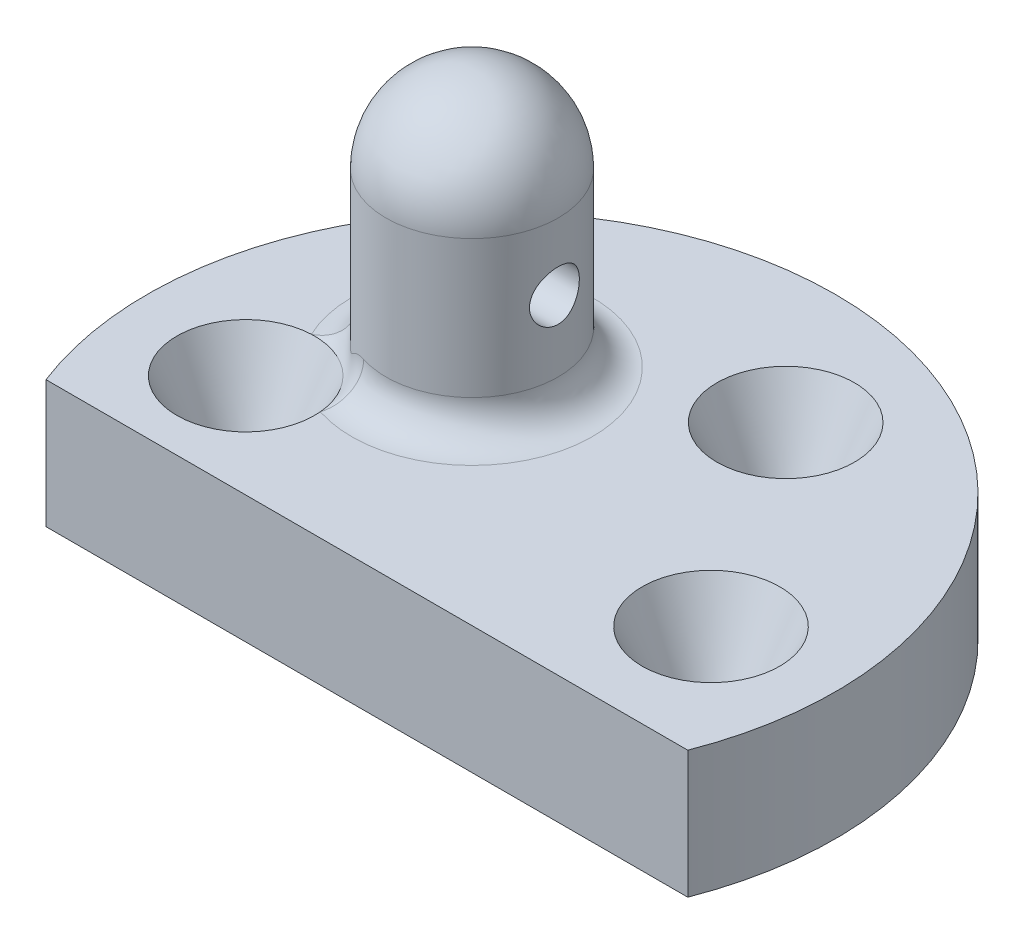
ISO-10303-21;
HEADER;
FILE_DESCRIPTION(('STEP AP214'),'2;1');
FILE_NAME('part.step','',(''),(''),'','','');
FILE_SCHEMA(('AUTOMOTIVE_DESIGN { 1 0 10303 214 1 1 1 1 }'));
ENDSEC;
DATA;
#1=APPLICATION_CONTEXT('core data for automotive mechanical design processes');
#2=APPLICATION_PROTOCOL_DEFINITION('international standard','automotive_design',2000,#1);
#3=PRODUCT_CONTEXT('',#1,'mechanical');
#4=PRODUCT('Part','Part','',(#3));
#5=PRODUCT_RELATED_PRODUCT_CATEGORY('part','',(#4));
#6=PRODUCT_DEFINITION_FORMATION('','',#4);
#7=PRODUCT_DEFINITION_CONTEXT('part definition',#1,'design');
#8=PRODUCT_DEFINITION('design','',#6,#7);
#9=PRODUCT_DEFINITION_SHAPE('','',#8);
#10=(LENGTH_UNIT() NAMED_UNIT(*) SI_UNIT(.MILLI.,.METRE.));
#11=(NAMED_UNIT(*) PLANE_ANGLE_UNIT() SI_UNIT($,.RADIAN.));
#12=(NAMED_UNIT(*) SI_UNIT($,.STERADIAN.) SOLID_ANGLE_UNIT());
#13=UNCERTAINTY_MEASURE_WITH_UNIT(LENGTH_MEASURE(1.E-05),#10,'distance_accuracy_value','');
#14=(GEOMETRIC_REPRESENTATION_CONTEXT(3) GLOBAL_UNCERTAINTY_ASSIGNED_CONTEXT((#13)) GLOBAL_UNIT_ASSIGNED_CONTEXT((#10,
#11,#12)) REPRESENTATION_CONTEXT('',''));
#15=CARTESIAN_POINT('',(0.,0.,0.));
#16=DIRECTION('',(0.,0.,1.));
#17=DIRECTION('',(1.,0.,0.));
#18=AXIS2_PLACEMENT_3D('',#15,#16,#17);
#19=CARTESIAN_POINT('',(0.,7.4,0.));
#20=DIRECTION('',(0.,-1.,0.));
#21=DIRECTION('',(0.,0.,-1.));
#22=AXIS2_PLACEMENT_3D('',#19,#20,#21);
#23=CYLINDRICAL_SURFACE('',#22,20.);
#24=CARTESIAN_POINT('',(0.,0.,0.));
#25=DIRECTION('',(0.,1.,0.));
#26=DIRECTION('',(0.,0.,1.));
#27=AXIS2_PLACEMENT_3D('',#24,#25,#26);
#28=CIRCLE('',#27,20.);
#29=CARTESIAN_POINT('',(18.6474421838492,0.,7.23));
#30=VERTEX_POINT('',#29);
#31=CARTESIAN_POINT('',(-18.6474421838492,0.,7.23));
#32=VERTEX_POINT('',#31);
#33=EDGE_CURVE('E104',#30,#32,#28,.T.);
#34=ORIENTED_EDGE('',*,*,#33,.T.);
#35=DIRECTION('',(0.,-1.,0.));
#36=VECTOR('',#35,1.);
#37=CARTESIAN_POINT('',(-18.6474421838492,7.4,7.23));
#38=LINE('',#37,#36);
#39=CARTESIAN_POINT('',(-18.6474421838492,7.4,7.23));
#40=VERTEX_POINT('',#39);
#41=EDGE_CURVE('E91',#40,#32,#38,.T.);
#42=ORIENTED_EDGE('',*,*,#41,.F.);
#43=CARTESIAN_POINT('',(0.,7.4,0.));
#44=DIRECTION('',(0.,1.,0.));
#45=DIRECTION('',(0.,0.,1.));
#46=AXIS2_PLACEMENT_3D('',#43,#44,#45);
#47=CIRCLE('',#46,20.);
#48=CARTESIAN_POINT('',(18.6474421838492,7.4,7.23));
#49=VERTEX_POINT('',#48);
#50=EDGE_CURVE('E97',#49,#40,#47,.T.);
#51=ORIENTED_EDGE('',*,*,#50,.F.);
#52=DIRECTION('',(0.,-1.,0.));
#53=VECTOR('',#52,1.);
#54=CARTESIAN_POINT('',(18.6474421838492,7.4,7.23));
#55=LINE('',#54,#53);
#56=EDGE_CURVE('E94',#49,#30,#55,.T.);
#57=ORIENTED_EDGE('',*,*,#56,.T.);
#58=EDGE_LOOP('',(#34,#42,#51,#57));
#59=FACE_BOUND('',#58,.T.);
#60=ADVANCED_FACE('F35',(#59),#23,.T.);
#61=CARTESIAN_POINT('',(-18.6474421838492,7.4,7.23));
#62=DIRECTION('',(0.,0.,-1.));
#63=DIRECTION('',(-1.,0.,0.));
#64=AXIS2_PLACEMENT_3D('',#61,#62,#63);
#65=PLANE('',#64);
#66=DIRECTION('',(1.,0.,0.));
#67=VECTOR('',#66,1.);
#68=CARTESIAN_POINT('',(-18.6474421838492,0.,7.23));
#69=LINE('',#68,#67);
#70=EDGE_CURVE('E101',#32,#30,#69,.T.);
#71=ORIENTED_EDGE('',*,*,#70,.T.);
#72=ORIENTED_EDGE('',*,*,#56,.F.);
#73=DIRECTION('',(1.,0.,0.));
#74=VECTOR('',#73,1.);
#75=CARTESIAN_POINT('',(-18.6474421838492,7.4,7.23));
#76=LINE('',#75,#74);
#77=EDGE_CURVE('E87',#40,#49,#76,.T.);
#78=ORIENTED_EDGE('',*,*,#77,.F.);
#79=ORIENTED_EDGE('',*,*,#41,.T.);
#80=EDGE_LOOP('',(#71,#72,#78,#79));
#81=FACE_BOUND('',#80,.T.);
#82=ADVANCED_FACE('F89',(#81),#65,.F.);
#83=CARTESIAN_POINT('',(0.,7.4,0.));
#84=DIRECTION('',(0.,1.,0.));
#85=DIRECTION('',(0.,0.,1.));
#86=AXIS2_PLACEMENT_3D('',#83,#84,#85);
#87=PLANE('',#86);
#88=CARTESIAN_POINT('',(5.,7.4,-12.1082616423663));
#89=DIRECTION('',(0.,1.,0.));
#90=DIRECTION('',(0.,0.,1.));
#91=AXIS2_PLACEMENT_3D('',#88,#89,#90);
#92=CIRCLE('',#91,4.);
#93=CARTESIAN_POINT('',(5.,7.4,-8.10826164236633));
#94=VERTEX_POINT('',#93);
#95=EDGE_CURVE('E117',#94,#94,#92,.T.);
#96=ORIENTED_EDGE('',*,*,#95,.F.);
#97=EDGE_LOOP('',(#96));
#98=FACE_BOUND('',#97,.T.);
#99=CARTESIAN_POINT('',(-13.0421278938676,7.4,1.23));
#100=DIRECTION('',(0.,1.,0.));
#101=DIRECTION('',(0.,0.,1.));
#102=AXIS2_PLACEMENT_3D('',#99,#100,#101);
#103=CIRCLE('',#102,4.);
#104=CARTESIAN_POINT('',(-13.2179592442186,7.4,-2.76613354834817));
#105=VERTEX_POINT('',#104);
#106=CARTESIAN_POINT('',(-9.05753965042086,7.4,0.879205857822828));
#107=VERTEX_POINT('',#106);
#108=EDGE_CURVE('E184',#105,#107,#103,.T.);
#109=ORIENTED_EDGE('',*,*,#108,.F.);
#110=CARTESIAN_POINT('',(-6.9,7.4,-5.78));
#111=DIRECTION('',(0.,1.,0.));
#112=DIRECTION('',(0.,0.,1.));
#113=AXIS2_PLACEMENT_3D('',#110,#111,#112);
#114=CIRCLE('',#113,7.);
#115=EDGE_CURVE('E11',#105,#107,#114,.F.);
#116=ORIENTED_EDGE('',*,*,#115,.T.);
#117=EDGE_LOOP('',(#109,#116));
#118=FACE_BOUND('',#117,.T.);
#119=CARTESIAN_POINT('',(13.0958428518366,7.4,0.33));
#120=DIRECTION('',(0.,1.,0.));
#121=DIRECTION('',(0.,0.,1.));
#122=AXIS2_PLACEMENT_3D('',#119,#120,#121);
#123=CIRCLE('',#122,3.99999999999999);
#124=CARTESIAN_POINT('',(13.0958428518366,7.4,4.33));
#125=VERTEX_POINT('',#124);
#126=EDGE_CURVE('E188',#125,#125,#123,.T.);
#127=ORIENTED_EDGE('',*,*,#126,.F.);
#128=EDGE_LOOP('',(#127));
#129=FACE_BOUND('',#128,.T.);
#130=ORIENTED_EDGE('',*,*,#50,.T.);
#131=ORIENTED_EDGE('',*,*,#77,.T.);
#132=EDGE_LOOP('',(#130,#131));
#133=FACE_BOUND('',#132,.T.);
#134=ADVANCED_FACE('F99',(#98,#118,#129,#133),#87,.T.);
#135=CARTESIAN_POINT('',(0.,0.,0.));
#136=DIRECTION('',(0.,1.,0.));
#137=DIRECTION('',(0.,0.,1.));
#138=AXIS2_PLACEMENT_3D('',#135,#136,#137);
#139=PLANE('',#138);
#140=CARTESIAN_POINT('',(-13.0421278938676,0.,1.23));
#141=DIRECTION('',(0.,1.,0.));
#142=DIRECTION('',(0.,0.,1.));
#143=AXIS2_PLACEMENT_3D('',#140,#141,#142);
#144=CIRCLE('',#143,1.95);
#145=CARTESIAN_POINT('',(-13.0421278938676,0.,3.18));
#146=VERTEX_POINT('',#145);
#147=EDGE_CURVE('E192',#146,#146,#144,.T.);
#148=ORIENTED_EDGE('',*,*,#147,.T.);
#149=EDGE_LOOP('',(#148));
#150=FACE_BOUND('',#149,.T.);
#151=CARTESIAN_POINT('',(13.0958428518366,0.,0.33));
#152=DIRECTION('',(0.,1.,0.));
#153=DIRECTION('',(0.,0.,1.));
#154=AXIS2_PLACEMENT_3D('',#151,#152,#153);
#155=CIRCLE('',#154,1.95);
#156=CARTESIAN_POINT('',(13.0958428518366,0.,2.28));
#157=VERTEX_POINT('',#156);
#158=EDGE_CURVE('E195',#157,#157,#155,.T.);
#159=ORIENTED_EDGE('',*,*,#158,.T.);
#160=EDGE_LOOP('',(#159));
#161=FACE_BOUND('',#160,.T.);
#162=CARTESIAN_POINT('',(5.,0.,-12.1082616423663));
#163=DIRECTION('',(0.,1.,0.));
#164=DIRECTION('',(0.,0.,1.));
#165=AXIS2_PLACEMENT_3D('',#162,#163,#164);
#166=CIRCLE('',#165,1.95);
#167=CARTESIAN_POINT('',(5.,0.,-10.1582616423663));
#168=VERTEX_POINT('',#167);
#169=EDGE_CURVE('E123',#168,#168,#166,.T.);
#170=ORIENTED_EDGE('',*,*,#169,.T.);
#171=EDGE_LOOP('',(#170));
#172=FACE_BOUND('',#171,.T.);
#173=ORIENTED_EDGE('',*,*,#33,.F.);
#174=ORIENTED_EDGE('',*,*,#70,.F.);
#175=EDGE_LOOP('',(#173,#174));
#176=FACE_BOUND('',#175,.T.);
#177=ADVANCED_FACE('F201',(#150,#161,#172,#176),#139,.F.);
#178=CARTESIAN_POINT('',(-6.9,22.4,-5.78));
#179=DIRECTION('',(0.,-1.,0.));
#180=DIRECTION('',(0.,0.,-1.));
#181=AXIS2_PLACEMENT_3D('',#178,#179,#180);
#182=CYLINDRICAL_SURFACE('',#181,5.);
#183=CARTESIAN_POINT('',(-6.9,9.4,-5.78));
#184=DIRECTION('',(0.,1.,0.));
#185=DIRECTION('',(0.,0.,1.));
#186=AXIS2_PLACEMENT_3D('',#183,#184,#185);
#187=CIRCLE('',#186,5.);
#188=CARTESIAN_POINT('',(-8.44109975030061,9.4,-1.02342438726941));
#189=VERTEX_POINT('',#188);
#190=CARTESIAN_POINT('',(-11.4128280315847,9.4,-3.62723824882012));
#191=VERTEX_POINT('',#190);
#192=EDGE_CURVE('E108',#189,#191,#187,.T.);
#193=ORIENTED_EDGE('',*,*,#192,.T.);
#194=CARTESIAN_POINT('',(-11.5783910241215,9.32050066463674,-4.01572750817233));
#195=CARTESIAN_POINT('',(-11.3732602092712,7.24485580457266,-3.47177402739678));
#196=CARTESIAN_POINT('',(-13.3998237769256,7.4,-2.75397460524579));
#197=CARTESIAN_POINT('',(-11.5713514214629,9.32833156889077,-3.99705428064752));
#198=CARTESIAN_POINT('',(-11.3747104792325,7.24888364259444,-3.48221923165377));
#199=CARTESIAN_POINT('',(-13.3932870805705,7.4,-2.75455981861375));
#200=CARTESIAN_POINT('',(-11.5641531418636,9.33557119111976,-3.97830726081526));
#201=CARTESIAN_POINT('',(-11.3763328136171,7.25348828921939,-3.49243781522221));
#202=CARTESIAN_POINT('',(-13.3864488672079,7.4,-2.75515821077081));
#203=CARTESIAN_POINT('',(-11.5288878110366,9.36749190088617,-3.88811705545335));
#204=CARTESIAN_POINT('',(-11.3846920791351,7.27813141473979,-3.53974073669192));
#205=CARTESIAN_POINT('',(-13.3521302747712,7.4,-2.75806652212012));
#206=CARTESIAN_POINT('',(-11.4987724054441,9.38431023503515,-3.81596594237105));
#207=CARTESIAN_POINT('',(-11.3931074453743,7.30546989085235,-3.57260446726508));
#208=CARTESIAN_POINT('',(-13.3204177517182,7.4,-2.76048156474581));
#209=CARTESIAN_POINT('',(-11.4347046729989,9.40166712192551,-3.67222896314303));
#210=CARTESIAN_POINT('',(-11.4088038952867,7.37324997041467,-3.62037065440526));
#211=CARTESIAN_POINT('',(-13.2462699500961,7.4,-2.76495889784999));
#212=CARTESIAN_POINT('',(-11.4007409728857,9.40215608548816,-3.60064547866068));
#213=CARTESIAN_POINT('',(-11.4160496735144,7.41329786974475,-3.63536012660875));
#214=CARTESIAN_POINT('',(-13.2038024039252,7.4,-2.76702009491672));
#215=CARTESIAN_POINT('',(-11.3165918968563,9.38571641482548,-3.43364964030094));
#216=CARTESIAN_POINT('',(-11.4251152085679,7.51498839352857,-3.64325749791964));
#217=CARTESIAN_POINT('',(-13.0887022675885,7.4,-2.77029159536295));
#218=CARTESIAN_POINT('',(-11.2650602401532,9.3622641741387,-3.33924034247615));
#219=CARTESIAN_POINT('',(-11.4242669150903,7.57887117453066,-3.62707089469649));
#220=CARTESIAN_POINT('',(-13.0107233001823,7.4,-2.77090326462322));
#221=CARTESIAN_POINT('',(-11.1582477751823,9.29318479670108,-3.15730640986056));
#222=CARTESIAN_POINT('',(-11.3995023959956,7.69780510541673,-3.55210044509184));
#223=CARTESIAN_POINT('',(-12.8293876983046,7.4,-2.76537044893168));
#224=CARTESIAN_POINT('',(-11.1029691092196,9.24757024047594,-3.06977790187233));
#225=CARTESIAN_POINT('',(-11.3765212377852,7.75277551317189,-3.49514319485775));
#226=CARTESIAN_POINT('',(-12.7260454778333,7.4,-2.75922979446787));
#227=CARTESIAN_POINT('',(-11.0038606978332,9.1541650368305,-2.92270810978347));
#228=CARTESIAN_POINT('',(-11.3133666627492,7.83085518038586,-3.36789631615236));
#229=CARTESIAN_POINT('',(-12.5216318800588,7.4,-2.73696449412816));
#230=CARTESIAN_POINT('',(-10.9606105984719,9.1097491734493,-2.86162786594792));
#231=CARTESIAN_POINT('',(-11.2796822673573,7.85854796525739,-3.30562420814129));
#232=CARTESIAN_POINT('',(-12.4264118491184,7.4,-2.72370909745354));
#233=CARTESIAN_POINT('',(-10.8725644805338,9.01516820502861,-2.74286223427067));
#234=CARTESIAN_POINT('',(-11.198281087302,7.90083061371576,-3.16899259883683));
#235=CARTESIAN_POINT('',(-12.2205030515999,7.4,-2.68610991155991));
#236=CARTESIAN_POINT('',(-10.8277666245942,8.96499609046491,-2.6851811177497));
#237=CARTESIAN_POINT('',(-11.1509328984009,7.91578826147009,-3.09493733151527));
#238=CARTESIAN_POINT('',(-12.1097953886143,7.4,-2.66175249356947));
#239=CARTESIAN_POINT('',(-10.7360154757701,8.86224592248549,-2.5721458142824));
#240=CARTESIAN_POINT('',(-11.0424357599617,7.93368386418454,-2.93824110018311));
#241=CARTESIAN_POINT('',(-11.8725635807401,7.4,-2.59718724403394));
#242=CARTESIAN_POINT('',(-10.6890528371935,8.80965744113249,-2.5168041786044));
#243=CARTESIAN_POINT('',(-10.9814622693608,7.93690432617037,-2.85560636275591));
#244=CARTESIAN_POINT('',(-11.7459657959634,7.4,-2.55690360430966));
#245=CARTESIAN_POINT('',(-10.6162897338177,8.73317504161531,-2.43477742705295));
#246=CARTESIAN_POINT('',(-10.8789436781068,7.93518529360411,-2.72639786396217));
#247=CARTESIAN_POINT('',(-11.5450818200005,7.4,-2.47997837302856));
#248=CARTESIAN_POINT('',(-10.5916661637487,8.70809700823823,-2.40761737915409));
#249=CARTESIAN_POINT('',(-10.8432602212096,7.9335660282981,-2.68281704398361));
#250=CARTESIAN_POINT('',(-11.4763391487693,7.4,-2.45161125595768));
#251=CARTESIAN_POINT('',(-10.5414100430953,8.65976005122638,-2.35341260016271));
#252=CARTESIAN_POINT('',(-10.7682231537883,7.9288476056788,-2.59424110284122));
#253=CARTESIAN_POINT('',(-11.3353866069364,7.4,-2.38842622200861));
#254=CARTESIAN_POINT('',(-10.5157779646606,8.63650029121893,-2.32636782152584));
#255=CARTESIAN_POINT('',(-10.7288593064341,7.92576092907234,-2.5492032377476));
#256=CARTESIAN_POINT('',(-11.263178355403,7.4,-2.35361129613143));
#257=CARTESIAN_POINT('',(-10.4703515863588,8.59901057617915,-2.27952207725024));
#258=CARTESIAN_POINT('',(-10.6573231890333,7.91983352999788,-2.47009720578168));
#259=CARTESIAN_POINT('',(-11.1356524936473,7.4,-2.28696294726596));
#260=CARTESIAN_POINT('',(-10.4508533997225,8.58403986042697,-2.25974028200059));
#261=CARTESIAN_POINT('',(-10.6261289872594,7.91715707585777,-2.43639302445009));
#262=CARTESIAN_POINT('',(-11.0810487061288,7.4,-2.25686990502633));
#263=CARTESIAN_POINT('',(-10.4110916308495,8.55647031167024,-2.22008087949565));
#264=CARTESIAN_POINT('',(-10.5615954731984,7.91183067168178,-2.36837802518859));
#265=CARTESIAN_POINT('',(-10.9705504876743,7.4,-2.19237613163531));
#266=CARTESIAN_POINT('',(-10.3908279585898,8.54387175868786,-2.20020326121262));
#267=CARTESIAN_POINT('',(-10.528232683003,7.9091777582682,-2.33403412832572));
#268=CARTESIAN_POINT('',(-10.9146559052396,7.4,-2.15797489271956));
#269=CARTESIAN_POINT('',(-10.349750692239,8.52197320632402,-2.16060455284182));
#270=CARTESIAN_POINT('',(-10.4598275510391,7.90434597430035,-2.26537046111166));
#271=CARTESIAN_POINT('',(-10.802867500547,7.4,-2.08513252902455));
#272=CARTESIAN_POINT('',(-10.3289467200285,8.51263513605673,-2.14088447936385));
#273=CARTESIAN_POINT('',(-10.4247783707045,7.90215720559863,-2.23101666137013));
#274=CARTESIAN_POINT('',(-10.7469818539452,7.4,-2.04674532833701));
#275=CARTESIAN_POINT('',(-10.286623499819,8.49781942252038,-2.10146544844803));
#276=CARTESIAN_POINT('',(-10.3528923646914,7.89860427947205,-2.16231399381081));
#277=CARTESIAN_POINT('',(-10.6354982134146,7.4,-1.96575844382007));
#278=CARTESIAN_POINT('',(-10.2651045039164,8.4923404334629,-2.08176648604331));
#279=CARTESIAN_POINT('',(-10.3160105237568,7.89723520512734,-2.12791705179523));
#280=CARTESIAN_POINT('',(-10.5799001259254,7.4,-1.92316023442336));
#281=CARTESIAN_POINT('',(-10.22114802063,8.4857427553695,-2.04223812593626));
#282=CARTESIAN_POINT('',(-10.240301351278,7.89558213891593,-2.05908350667931));
#283=CARTESIAN_POINT('',(-10.4692718263655,7.4,-1.83358586393406));
#284=CARTESIAN_POINT('',(-10.1987010711379,8.48470147265851,-2.02241240788558));
#285=CARTESIAN_POINT('',(-10.2013920345284,7.89531479245061,-2.02460063533504));
#286=CARTESIAN_POINT('',(-10.4142682613081,7.4,-1.78654650098892));
#287=CARTESIAN_POINT('',(-10.1535344488137,8.48731424033104,-1.98323721030445));
#288=CARTESIAN_POINT('',(-10.1229703339427,7.89597470348436,-1.9568733823552));
#289=CARTESIAN_POINT('',(-10.3072245856416,7.4,-1.68984749212574));
#290=CARTESIAN_POINT('',(-10.1308147509564,8.49096872487368,-1.96388777497852));
#291=CARTESIAN_POINT('',(-10.0833941622411,7.89690314465391,-1.92357486843949));
#292=CARTESIAN_POINT('',(-10.2551847495161,7.4,-1.6401876043275));
#293=CARTESIAN_POINT('',(-10.085130663743,8.50262379094405,-1.92567256636623));
#294=CARTESIAN_POINT('',(-10.0039349513034,7.89976418624108,-1.85840556850669));
#295=CARTESIAN_POINT('',(-10.1545883248353,7.4,-1.53898313907443));
#296=CARTESIAN_POINT('',(-10.0621662716959,8.5106707091281,-1.90681423662039));
#297=CARTESIAN_POINT('',(-9.9639923978152,7.90171174435442,-1.82650764185008));
#298=CARTESIAN_POINT('',(-10.1060752364979,7.4,-1.48742403267229));
#299=CARTESIAN_POINT('',(-10.0164035545161,8.5303675556443,-1.86989847988107));
#300=CARTESIAN_POINT('',(-9.88475269566533,7.90622880600161,-1.76481552806282));
#301=CARTESIAN_POINT('',(-10.0136691012736,7.4,-1.38404885614391));
#302=CARTESIAN_POINT('',(-9.99360523964561,8.54201770472459,-1.85184110203459));
#303=CARTESIAN_POINT('',(-9.84540322579655,7.90880366103605,-1.7349863646262));
#304=CARTESIAN_POINT('',(-9.9697763376669,7.4,-1.33223277046553));
#305=CARTESIAN_POINT('',(-9.93788782699475,8.57398780945237,-1.80847755952398));
#306=CARTESIAN_POINT('',(-9.7498321665596,7.91534922952718,-1.66433532785091));
#307=CARTESIAN_POINT('',(-9.8677267821057,7.4,-1.20566614368314));
#308=CARTESIAN_POINT('',(-9.9050832375852,8.595840719788,-1.78361121735776));
#309=CARTESIAN_POINT('',(-9.69412448074879,7.91942206429592,-1.62473909965528));
#310=CARTESIAN_POINT('',(-9.81216589499618,7.4,-1.13120683786476));
#311=CARTESIAN_POINT('',(-9.83972500828057,8.64310551952925,-1.73529091450855));
#312=CARTESIAN_POINT('',(-9.58494725629819,7.92670932521443,-1.54986985715855));
#313=CARTESIAN_POINT('',(-9.70999308790797,7.4,-0.984695867650283));
#314=CARTESIAN_POINT('',(-9.80717172060777,8.66852168907945,-1.71183870163945));
#315=CARTESIAN_POINT('',(-9.5313967581356,7.92992160305028,-1.51457102467818));
#316=CARTESIAN_POINT('',(-9.66339209248747,7.4,-0.912647229778751));
#317=CARTESIAN_POINT('',(-9.74193095048648,8.72134990098959,-1.66599663993118));
#318=CARTESIAN_POINT('',(-9.42641958982892,7.93452665751749,-1.44784330990462));
#319=CARTESIAN_POINT('',(-9.57784380346967,7.4,-0.771394137326742));
#320=CARTESIAN_POINT('',(-9.70924342490986,8.74876910832875,-1.64361113074835));
#321=CARTESIAN_POINT('',(-9.37495105328549,7.93589500972192,-1.41642614924346));
#322=CARTESIAN_POINT('',(-9.53892603454434,7.4,-0.702201432672253));
#323=CARTESIAN_POINT('',(-9.64359041528746,8.80432686648068,-1.59977679784779));
#324=CARTESIAN_POINT('',(-9.27447598824839,7.93607141687731,-1.3573624724821));
#325=CARTESIAN_POINT('',(-9.46786499330219,7.4,-0.567341781584571));
#326=CARTESIAN_POINT('',(-9.6106250725088,8.8324650649299,-1.57832752874433));
#327=CARTESIAN_POINT('',(-9.22544184540691,7.93484772154117,-1.32972862836605));
#328=CARTESIAN_POINT('',(-9.43571847131552,7.4,-0.501673155197753));
#329=CARTESIAN_POINT('',(-9.51073276244305,8.9167695372516,-1.51498866574802));
#330=CARTESIAN_POINT('',(-9.08106043030824,7.92639451292031,-1.25152579954353));
#331=CARTESIAN_POINT('',(-9.34774044666107,7.4,-0.309937784268806));
#332=CARTESIAN_POINT('',(-9.44297017697594,8.97268374823766,-1.4742208393341));
#333=CARTESIAN_POINT('',(-8.99072356985742,7.91419275510677,-1.20710710433978));
#334=CARTESIAN_POINT('',(-9.30057432181562,7.4,-0.189497872292745));
#335=CARTESIAN_POINT('',(-9.30397626274104,9.07856306347258,-1.39511054025221));
#336=CARTESIAN_POINT('',(-8.82452805830688,7.87518126962512,-1.13219040113695));
#337=CARTESIAN_POINT('',(-9.22300285294601,7.4,0.0348966878804349));
#338=CARTESIAN_POINT('',(-9.23275420845469,9.12854295737239,-1.35676215467637));
#339=CARTESIAN_POINT('',(-8.74900840283244,7.84791390718774,-1.10206580582839));
#340=CARTESIAN_POINT('',(-9.19255512518005,7.4,0.138892542734694));
#341=CARTESIAN_POINT('',(-9.07372183352496,9.22627704302777,-1.27620810926826));
#342=CARTESIAN_POINT('',(-8.60643493617765,7.77377786229153,-1.05119290754334));
#343=CARTESIAN_POINT('',(-9.13926956516629,7.4,0.346241466636164));
#344=CARTESIAN_POINT('',(-8.98512386418383,9.27227546543999,-1.23442314431904));
#345=CARTESIAN_POINT('',(-8.54446952041005,7.72402088726433,-1.03372555529487));
#346=CARTESIAN_POINT('',(-9.11854251653581,7.4,0.446605195411716));
#347=CARTESIAN_POINT('',(-8.80204658070446,9.34519655419571,-1.15483687443811));
#348=CARTESIAN_POINT('',(-8.45674805586103,7.61403719076177,-1.01416609509851));
#349=CARTESIAN_POINT('',(-9.08708692506316,7.4,0.625141626723973));
#350=CARTESIAN_POINT('',(-8.70756492152204,9.37211156089749,-1.11703717427573));
#351=CARTESIAN_POINT('',(-8.43264652543166,7.55373471581943,-1.01272390773457));
#352=CARTESIAN_POINT('',(-9.07636239645703,7.4,0.703305411179787));
#353=CARTESIAN_POINT('',(-8.53017288078156,9.39931122178079,-1.05242377559548));
#354=CARTESIAN_POINT('',(-8.42483657245824,7.4474689338749,-1.01767140581779));
#355=CARTESIAN_POINT('',(-9.06197010240691,7.4,0.828019375407396));
#356=CARTESIAN_POINT('',(-8.44783919016998,9.40317671968226,-1.02482055414213));
#357=CARTESIAN_POINT('',(-8.43610361048098,7.4009906339209,-1.02300766511739));
#358=CARTESIAN_POINT('',(-9.05744599111662,7.4,0.877630023525841));
#359=CARTESIAN_POINT('',(-8.28263751648371,9.39150681702319,-0.974201112100334));
#360=CARTESIAN_POINT('',(-8.48177741301022,7.32140004934063,-1.03341907069687));
#361=CARTESIAN_POINT('',(-9.05076898258357,7.4,0.963683582170434));
#362=CARTESIAN_POINT('',(-8.19977239730255,9.37603901526377,-0.951169233435862));
#363=CARTESIAN_POINT('',(-8.51638372299211,7.28881801297296,-1.03844917623901));
#364=CARTESIAN_POINT('',(-9.04860787254644,7.4,1.00017180197787));
#365=CARTESIAN_POINT('',(-8.08992254202931,9.34166636099005,-0.923565631746707));
#366=CARTESIAN_POINT('',(-8.57072311665974,7.25749644616898,-1.0416410924074));
#367=CARTESIAN_POINT('',(-9.04654835411583,7.4,1.04175574247327));
#368=CARTESIAN_POINT('',(-8.06197518227258,9.33168830390744,-0.91680329756314));
#369=CARTESIAN_POINT('',(-8.58536122982104,7.25057517149217,-1.04214124908886));
#370=CARTESIAN_POINT('',(-9.04609599747485,7.4,1.05173180719453));
#371=CARTESIAN_POINT('',(-8.03421716180459,9.32049803962008,-0.91034380783736));
#372=CARTESIAN_POINT('',(-8.60041880332447,7.244854452779,-1.04222080151247));
#373=CARTESIAN_POINT('',(-9.04569566609441,7.4,1.06109337249348));
#374=(BOUNDED_SURFACE() B_SPLINE_SURFACE(3,2,((#194,#195,#196),(#197,#198,#199),(#200,#201,
#202),(#203,#204,#205),(#206,#207,#208),(#209,#210,#211),(#212,#213,#214),(#215,#216,#217),
(#218,#219,#220),(#221,#222,#223),(#224,#225,#226),(#227,#228,#229),(#230,#231,#232),(#233,#234,
#235),(#236,#237,#238),(#239,#240,#241),(#242,#243,#244),(#245,#246,#247),(#248,#249,#250),
(#251,#252,#253),(#254,#255,#256),(#257,#258,#259),(#260,#261,#262),(#263,#264,#265),(#266,#267,
#268),(#269,#270,#271),(#272,#273,#274),(#275,#276,#277),(#278,#279,#280),(#281,#282,#283),
(#284,#285,#286),(#287,#288,#289),(#290,#291,#292),(#293,#294,#295),(#296,#297,#298),(#299,#300,
#301),(#302,#303,#304),(#305,#306,#307),(#308,#309,#310),(#311,#312,#313),(#314,#315,#316),
(#317,#318,#319),(#320,#321,#322),(#323,#324,#325),(#326,#327,#328),(#329,#330,#331),(#332,#333,
#334),(#335,#336,#337),(#338,#339,#340),(#341,#342,#343),(#344,#345,#346),(#347,#348,#349),
(#350,#351,#352),(#353,#354,#355),(#356,#357,#358),(#359,#360,#361),(#362,#363,#364),(#365,#366,
#367),(#368,#369,#370),(#371,#372,#373)),.UNSPECIFIED.,.F.,.F.,
.F.) B_SPLINE_SURFACE_WITH_KNOTS((4,2,2,2,2,2,2,2,2,2,2,2,2,2,2,2,2,2,2,2,2,2,2,2,2,2,2,2,2,4),
(3,3),(0.,0.0870655254022178,0.417689020325731,0.749316464629449,1.20387279967185,
1.65817140495782,1.99926228157747,2.34077301166179,2.68392927818857,2.85527730328219,
3.0265460418668,3.15149241602137,3.27645353024834,3.39990249221312,3.52330838212466,
3.64885823396412,3.77441969467029,3.90133207194644,4.02825222591593,4.21291679087112,
4.39780510410711,4.58339062830115,4.76888688197302,5.14080683676327,5.51177951121364,
5.9445119560506,6.37741799150881,6.74084238107843,7.10299960604321,7.22734161359943),(0.,1.),
.UNSPECIFIED.) GEOMETRIC_REPRESENTATION_ITEM() RATIONAL_B_SPLINE_SURFACE(((1.,0.680167237527768,
1.),(1.,0.680933474395332,1.),(1.,0.681777849324703,1.),(1.,0.686205156394218,1.),(1.,
0.690841297608109,1.),(1.,0.702431829772157,1.),(1.,0.709393217418023,1.),(1.,0.728377067017552,
1.),(1.,0.741319047467469,1.),(1.,0.769865222678362,1.),(1.,0.785467903824822,1.),(1.,
0.813696763628207,1.),(1.,0.826095787027338,1.),(1.,0.850766905056485,1.),(1.,0.863038824661763,
1.),(1.,0.886716320924823,1.),(1.,0.898117438275564,1.),(1.,0.913813010358111,1.),(1.,
0.91880763222924,1.),(1.,0.928183225164782,1.),(1.,0.932564479109546,1.),(1.,0.939459579394773,
1.),(1.,0.942157999155861,1.),(1.,0.94705149606127,1.),(1.,0.949246513788109,1.),(1.,
0.9530164877153,1.),(1.,0.954598625844622,1.),(1.,0.957090919361135,1.),(1.,0.95800130901437,
1.),(1.,0.959096057647571,1.),(1.,0.959267528329017,1.),(1.,0.95883513537138,1.),(1.,
0.958231200040161,1.),(1.,0.956284560429792,1.),(1.,0.954933977640013,1.),(1.,0.951577775176498,
1.),(1.,0.949572115369739,1.),(1.,0.94396656716944,1.),(1.,0.940056518743603,1.),(1.,
0.931332690902567,1.),(1.,0.926517822224653,1.),(1.,0.9161847652116,1.),(1.,0.910663993137948,
1.),(1.,0.899112477277838,1.),(1.,0.893081980075852,1.),(1.,0.874418201241822,1.),(1.,
0.861240073187803,1.),(1.,0.834521927767842,1.),(1.,0.820982917623495,1.),(1.,0.7922500562975,
1.),(1.,0.777155950681856,1.),(1.,0.74913921926289,1.),(1.,0.736217466977664,1.),(1.,
0.715531397884136,1.),(1.,0.707272179721263,1.),(1.,0.69353485812898,1.),(1.,0.688047158098961,
1.),(1.,0.682512523911481,1.),(1.,0.681259170756919,1.),(1.,0.680166981298721,1.))) REPRESENTATION_ITEM('') SURFACE());
#375=CARTESIAN_POINT('',(-11.5783910241215,9.32050066463674,-4.01572750817233));
#376=CARTESIAN_POINT('',(-11.5713514214629,9.32833156889077,-3.99705428064752));
#377=CARTESIAN_POINT('',(-11.5641531418636,9.33557119111976,-3.97830726081526));
#378=CARTESIAN_POINT('',(-11.5288878110366,9.36749190088617,-3.88811705545335));
#379=CARTESIAN_POINT('',(-11.4987724054441,9.38431023503515,-3.81596594237105));
#380=CARTESIAN_POINT('',(-11.4347046729989,9.40166712192551,-3.67222896314303));
#381=CARTESIAN_POINT('',(-11.4007409728857,9.40215608548816,-3.60064547866068));
#382=CARTESIAN_POINT('',(-11.3165918968563,9.38571641482548,-3.43364964030094));
#383=CARTESIAN_POINT('',(-11.2650602401532,9.36226417413869,-3.33924034247615));
#384=CARTESIAN_POINT('',(-11.1582477751823,9.29318479670108,-3.15730640986056));
#385=CARTESIAN_POINT('',(-11.1029691092196,9.24757024047594,-3.06977790187233));
#386=CARTESIAN_POINT('',(-11.0038606978332,9.1541650368305,-2.92270810978347));
#387=CARTESIAN_POINT('',(-10.9606105984719,9.1097491734493,-2.86162786594792));
#388=CARTESIAN_POINT('',(-10.8725644805338,9.01516820502861,-2.74286223427067));
#389=CARTESIAN_POINT('',(-10.8277666245942,8.96499609046491,-2.6851811177497));
#390=CARTESIAN_POINT('',(-10.7360154757701,8.86224592248549,-2.5721458142824));
#391=CARTESIAN_POINT('',(-10.6890528371935,8.80965744113249,-2.5168041786044));
#392=CARTESIAN_POINT('',(-10.6162897338177,8.73317504161531,-2.43477742705295));
#393=CARTESIAN_POINT('',(-10.5916661637487,8.70809700823823,-2.40761737915409));
#394=CARTESIAN_POINT('',(-10.5414100430953,8.65976005122638,-2.35341260016271));
#395=CARTESIAN_POINT('',(-10.5157779646606,8.63650029121893,-2.32636782152584));
#396=CARTESIAN_POINT('',(-10.4703515863588,8.59901057617915,-2.27952207725024));
#397=CARTESIAN_POINT('',(-10.4508533997225,8.58403986042697,-2.25974028200059));
#398=CARTESIAN_POINT('',(-10.4110916308495,8.55647031167024,-2.22008087949565));
#399=CARTESIAN_POINT('',(-10.3908279585898,8.54387175868785,-2.20020326121262));
#400=CARTESIAN_POINT('',(-10.349750692239,8.52197320632402,-2.16060455284182));
#401=CARTESIAN_POINT('',(-10.3289467200285,8.51263513605673,-2.14088447936385));
#402=CARTESIAN_POINT('',(-10.286623499819,8.49781942252038,-2.10146544844803));
#403=CARTESIAN_POINT('',(-10.2651045039164,8.4923404334629,-2.08176648604331));
#404=CARTESIAN_POINT('',(-10.22114802063,8.4857427553695,-2.04223812593626));
#405=CARTESIAN_POINT('',(-10.1987010711379,8.48470147265851,-2.02241240788558));
#406=CARTESIAN_POINT('',(-10.1535344488137,8.48731424033104,-1.98323721030445));
#407=CARTESIAN_POINT('',(-10.1308147509564,8.49096872487368,-1.96388777497852));
#408=CARTESIAN_POINT('',(-10.085130663743,8.50262379094405,-1.92567256636623));
#409=CARTESIAN_POINT('',(-10.0621662716959,8.5106707091281,-1.90681423662039));
#410=CARTESIAN_POINT('',(-10.0164035545161,8.5303675556443,-1.86989847988107));
#411=CARTESIAN_POINT('',(-9.99360523964561,8.54201770472459,-1.85184110203459));
#412=CARTESIAN_POINT('',(-9.93788782699475,8.57398780945236,-1.80847755952398));
#413=CARTESIAN_POINT('',(-9.9050832375852,8.595840719788,-1.78361121735776));
#414=CARTESIAN_POINT('',(-9.83972500828057,8.64310551952925,-1.73529091450855));
#415=CARTESIAN_POINT('',(-9.80717172060777,8.66852168907945,-1.71183870163945));
#416=CARTESIAN_POINT('',(-9.74193095048648,8.72134990098959,-1.66599663993118));
#417=CARTESIAN_POINT('',(-9.70924342490986,8.74876910832875,-1.64361113074835));
#418=CARTESIAN_POINT('',(-9.64359041528746,8.80432686648068,-1.59977679784779));
#419=CARTESIAN_POINT('',(-9.6106250725088,8.8324650649299,-1.57832752874433));
#420=CARTESIAN_POINT('',(-9.51073276244304,8.9167695372516,-1.51498866574802));
#421=CARTESIAN_POINT('',(-9.44297017697594,8.97268374823766,-1.4742208393341));
#422=CARTESIAN_POINT('',(-9.30397626274104,9.07856306347258,-1.39511054025221));
#423=CARTESIAN_POINT('',(-9.23275420845469,9.12854295737239,-1.35676215467637));
#424=CARTESIAN_POINT('',(-9.07372183352496,9.22627704302777,-1.27620810926826));
#425=CARTESIAN_POINT('',(-8.98512386418383,9.27227546543999,-1.23442314431904));
#426=CARTESIAN_POINT('',(-8.80204658070446,9.34519655419571,-1.15483687443811));
#427=CARTESIAN_POINT('',(-8.70756492152204,9.37211156089749,-1.11703717427573));
#428=CARTESIAN_POINT('',(-8.53017288078156,9.39931122178079,-1.05242377559548));
#429=CARTESIAN_POINT('',(-8.44783919016998,9.40317671968226,-1.02482055414213));
#430=CARTESIAN_POINT('',(-8.28263751648371,9.39150681702319,-0.974201112100334));
#431=CARTESIAN_POINT('',(-8.19977239730255,9.37603901526377,-0.951169233435862));
#432=CARTESIAN_POINT('',(-8.08992254202931,9.34166636099005,-0.923565631746708));
#433=CARTESIAN_POINT('',(-8.06197518227258,9.33168830390744,-0.91680329756314));
#434=CARTESIAN_POINT('',(-8.03421716180459,9.32049803962008,-0.91034380783736));
#435=B_SPLINE_CURVE_WITH_KNOTS('',3,(#375,#376,#377,#378,#379,#380,#381,#382,#383,#384,#385,
#386,#387,#388,#389,#390,#391,#392,#393,#394,#395,#396,#397,#398,#399,#400,#401,#402,#403,#404,
#405,#406,#407,#408,#409,#410,#411,#412,#413,#414,#415,#416,#417,#418,#419,#420,#421,#422,#423,
#424,#425,#426,#427,#428,#429,#430,#431,#432,#433,#434),.UNSPECIFIED.,.F.,.F.,(4,2,2,2,2,2,2,2,
2,2,2,2,2,2,2,2,2,2,2,2,2,2,2,2,2,2,2,2,2,4),(0.,0.0870655254022178,0.417689020325731,
0.749316464629449,1.20387279967185,1.65817140495782,1.99926228157747,2.34077301166179,
2.68392927818857,2.85527730328219,3.0265460418668,3.15149241602137,3.27645353024834,
3.39990249221312,3.52330838212466,3.64885823396412,3.77441969467029,3.90133207194644,
4.02825222591593,4.21291679087112,4.39780510410711,4.58339062830115,4.76888688197302,
5.14080683676327,5.51177951121364,5.9445119560506,6.37741799150881,6.74084238107843,
7.10299960604321,7.22734161359943),.UNSPECIFIED.);
#436=EDGE_CURVE('E53',#191,#189,#435,.T.);
#437=ORIENTED_EDGE('',*,*,#436,.T.);
#438=EDGE_LOOP('',(#193,#437));
#439=FACE_BOUND('',#438,.T.);
#440=CARTESIAN_POINT('',(-6.9,17.4,-5.78));
#441=DIRECTION('',(0.,-1.,0.));
#442=DIRECTION('',(0.,0.,-1.));
#443=AXIS2_PLACEMENT_3D('',#440,#441,#442);
#444=CIRCLE('',#443,5.);
#445=CARTESIAN_POINT('',(-6.9,17.4,-10.78));
#446=VERTEX_POINT('',#445);
#447=EDGE_CURVE('E105',#446,#446,#444,.T.);
#448=ORIENTED_EDGE('',*,*,#447,.T.);
#449=EDGE_LOOP('',(#448));
#450=FACE_BOUND('',#449,.T.);
#451=CARTESIAN_POINT('',(-11.6851332269854,13.5,-7.23));
#452=CARTESIAN_POINT('',(-11.6851342628341,13.5795870913655,-7.22999869100188));
#453=CARTESIAN_POINT('',(-11.6871405092558,13.6591873017141,-7.22342517475206));
#454=CARTESIAN_POINT('',(-11.6949192313385,13.816069345042,-7.19736687000352));
#455=CARTESIAN_POINT('',(-11.7006931571755,13.8933502733468,-7.1778771100105));
#456=CARTESIAN_POINT('',(-11.7152995031418,14.043300587324,-7.12669665964465));
#457=CARTESIAN_POINT('',(-11.7241270820233,14.1159770583786,-7.09502527312825));
#458=CARTESIAN_POINT('',(-11.7438396591333,14.2550010265229,-7.02044319497749));
#459=CARTESIAN_POINT('',(-11.7547249207063,14.3213477118826,-6.97753106446917));
#460=CARTESIAN_POINT('',(-11.7776872972917,14.4477906612898,-6.88032746628817));
#461=CARTESIAN_POINT('',(-11.7897885176402,14.5076720528303,-6.82576212367778));
#462=CARTESIAN_POINT('',(-11.8136127413465,14.6175752846992,-6.70738859397166));
#463=CARTESIAN_POINT('',(-11.8253356990258,14.6675959379569,-6.64357929565784));
#464=CARTESIAN_POINT('',(-11.8473548582896,14.7572792601641,-6.50701260523335));
#465=CARTESIAN_POINT('',(-11.8576193334494,14.7967245432166,-6.43410689376189));
#466=CARTESIAN_POINT('',(-11.8752860248681,14.8627131517366,-6.28234939514112));
#467=CARTESIAN_POINT('',(-11.8826888159699,14.8892590686494,-6.20349880598045));
#468=CARTESIAN_POINT('',(-11.8936275226097,14.9279892086208,-6.04433628561259));
#469=CARTESIAN_POINT('',(-11.8972619034441,14.9405398180832,-5.96412039807029));
#470=CARTESIAN_POINT('',(-11.9006002774265,14.9520797882142,-5.8026447207355));
#471=CARTESIAN_POINT('',(-11.9003050437721,14.9510718166913,-5.72138513944541));
#472=CARTESIAN_POINT('',(-11.8958878510329,14.9357729409259,-5.56269279120872));
#473=CARTESIAN_POINT('',(-11.8918801156056,14.9218785030943,-5.48521812717362));
#474=CARTESIAN_POINT('',(-11.8806257854808,14.8818465095015,-5.33375147268994));
#475=CARTESIAN_POINT('',(-11.8733789911862,14.8557081992443,-5.25975969717436));
#476=CARTESIAN_POINT('',(-11.856299325715,14.7916511473883,-5.11639517905455));
#477=CARTESIAN_POINT('',(-11.8464385168752,14.7536042857988,-5.04708314745386));
#478=CARTESIAN_POINT('',(-11.825182005794,14.6669104820133,-4.91569793825825));
#479=CARTESIAN_POINT('',(-11.8137859590608,14.6182611592149,-4.85362639120421));
#480=CARTESIAN_POINT('',(-11.7901976783805,14.509671710933,-4.73611736278644));
#481=CARTESIAN_POINT('',(-11.7779915539725,14.4493872555907,-4.68100045236488));
#482=CARTESIAN_POINT('',(-11.7545222784042,14.3203091860323,-4.58157174581687));
#483=CARTESIAN_POINT('',(-11.7432592086894,14.2515148381406,-4.53726088230742));
#484=CARTESIAN_POINT('',(-11.7228879889348,14.1065727314494,-4.46039671517991));
#485=CARTESIAN_POINT('',(-11.7137988343222,14.0303677955544,-4.42794583163255));
#486=CARTESIAN_POINT('',(-11.6990325864331,13.873251542667,-4.37642863240485));
#487=CARTESIAN_POINT('',(-11.693354465295,13.7923416515077,-4.357358284418));
#488=CARTESIAN_POINT('',(-11.6862767598783,13.6311470156077,-4.33372803524282));
#489=CARTESIAN_POINT('',(-11.6847343884389,13.5509394976596,-4.32868364972667));
#490=CARTESIAN_POINT('',(-11.6857092548405,13.3908236603967,-4.33190115567256));
#491=CARTESIAN_POINT('',(-11.6882259683065,13.3109153037712,-4.34016132837807));
#492=CARTESIAN_POINT('',(-11.6968959615428,13.1556379368373,-4.36932327526153));
#493=CARTESIAN_POINT('',(-11.7029612958866,13.0802061593392,-4.38991960598691));
#494=CARTESIAN_POINT('',(-11.7179556131247,12.9338718536094,-4.44281842710627));
#495=CARTESIAN_POINT('',(-11.726885017938,12.8629699945466,-4.47512264233186));
#496=CARTESIAN_POINT('',(-11.7468832474832,12.725720092423,-4.5514590687151));
#497=CARTESIAN_POINT('',(-11.7580006028668,12.6595332188973,-4.59576803210633));
#498=CARTESIAN_POINT('',(-11.7810148384461,12.5353568761904,-4.69452312481286));
#499=CARTESIAN_POINT('',(-11.7929118924233,12.4773692436364,-4.74897151904843));
#500=CARTESIAN_POINT('',(-11.8166480490702,12.3691522005977,-4.86872633042236));
#501=CARTESIAN_POINT('',(-11.8284706089761,12.3192645739359,-4.93434560832491));
#502=CARTESIAN_POINT('',(-11.8503047248749,12.2312044311332,-5.07330201381109));
#503=CARTESIAN_POINT('',(-11.860316374434,12.1930313096567,-5.14663874233984));
#504=CARTESIAN_POINT('',(-11.8773375040178,12.1298499779853,-5.29844608869143));
#505=CARTESIAN_POINT('',(-11.884369588503,12.1047423020208,-5.37687264845926));
#506=CARTESIAN_POINT('',(-11.8947391216965,12.0681371404963,-5.53707057722644));
#507=CARTESIAN_POINT('',(-11.8980775520895,12.0566360385789,-5.61884105149957));
#508=CARTESIAN_POINT('',(-11.9006279940715,12.0478307187522,-5.78023687307498));
#509=CARTESIAN_POINT('',(-11.8999845566878,12.0500291950276,-5.85983315533317));
#510=CARTESIAN_POINT('',(-11.8949799637719,12.0673824255604,-6.01747463679376));
#511=CARTESIAN_POINT('',(-11.8906189957365,12.0825365263902,-6.09551991401925));
#512=CARTESIAN_POINT('',(-11.8787068352786,12.1250706578737,-6.24713127171411));
#513=CARTESIAN_POINT('',(-11.8711861972258,12.152333734033,-6.32073272683641));
#514=CARTESIAN_POINT('',(-11.8537345566216,12.2182077726595,-6.46235681722357));
#515=CARTESIAN_POINT('',(-11.843803173735,12.2568205259301,-6.53037856992975));
#516=CARTESIAN_POINT('',(-11.8222034787784,12.3456622812737,-6.66115963871579));
#517=CARTESIAN_POINT('',(-11.8104915185283,12.3962089269919,-6.72369591693621));
#518=CARTESIAN_POINT('',(-11.7868010990945,12.5069022747151,-6.83956576561687));
#519=CARTESIAN_POINT('',(-11.7748225661854,12.5670516616519,-6.89289675356803));
#520=CARTESIAN_POINT('',(-11.7515727628565,12.6972154373184,-6.9902984659651));
#521=CARTESIAN_POINT('',(-11.7403297265364,12.7674543038983,-7.03407665289222));
#522=CARTESIAN_POINT('',(-11.7202577938461,12.914611238388,-7.10914783845825));
#523=CARTESIAN_POINT('',(-11.7114276025193,12.9915256942343,-7.14044753836902));
#524=CARTESIAN_POINT('',(-11.698166564356,13.1399143111036,-7.18644791063515));
#525=CARTESIAN_POINT('',(-11.6933230940856,13.2108624483056,-7.20273711459614));
#526=CARTESIAN_POINT('',(-11.6868062209203,13.3545369402224,-7.22451284122198));
#527=CARTESIAN_POINT('',(-11.6851322802926,13.4272629911807,-7.2300011963323));
#528=CARTESIAN_POINT('',(-11.6851332269854,13.5,-7.23));
#529=B_SPLINE_CURVE_WITH_KNOTS('',3,(#451,#452,#453,#454,#455,#456,#457,#458,#459,#460,#461,
#462,#463,#464,#465,#466,#467,#468,#469,#470,#471,#472,#473,#474,#475,#476,#477,#478,#479,#480,
#481,#482,#483,#484,#485,#486,#487,#488,#489,#490,#491,#492,#493,#494,#495,#496,#497,#498,#499,
#500,#501,#502,#503,#504,#505,#506,#507,#508,#509,#510,#511,#512,#513,#514,#515,#516,#517,#518,
#519,#520,#521,#522,#523,#524,#525,#526,#527,#528),.UNSPECIFIED.,.T.,.F.,(4,2,2,2,2,2,2,2,2,2,2,
2,2,2,2,2,2,2,2,2,2,2,2,2,2,2,2,2,2,2,2,2,2,2,2,2,2,2,4),(0.,0.238493232961865,
0.477078315918094,0.715286867697193,0.953525926328668,1.19814270558599,1.44278891472171,
1.69213378520629,1.94142854229716,2.18403142188755,2.42658656723769,2.66191829753567,
2.897264531433,3.13523524914162,3.37325945428162,3.6198803780596,3.86652257895531,
4.1152470286024,4.36389649137938,4.60384360292594,4.84375971926139,5.07796777486047,
5.31221034854689,5.55239577617268,5.79263492030591,6.04126639344754,6.28988501663378,
6.53658217453046,6.78321375047939,7.02094586303767,7.25866598608789,7.49413839705011,
7.72964798187531,7.9723219890424,8.21506396720955,8.46443250768819,8.7136669498048,
8.93166999455158,9.14963605024806),.UNSPECIFIED.);
#530=CARTESIAN_POINT('',(-11.6851332269854,13.5,-7.23));
#531=VERTEX_POINT('',#530);
#532=EDGE_CURVE('E131',#531,#531,#529,.T.);
#533=ORIENTED_EDGE('',*,*,#532,.T.);
#534=EDGE_LOOP('',(#533));
#535=FACE_BOUND('',#534,.T.);
#536=CARTESIAN_POINT('',(-2.11486677301457,13.5,-7.23));
#537=CARTESIAN_POINT('',(-2.11486573716592,13.4204129086345,-7.22999869100188));
#538=CARTESIAN_POINT('',(-2.11285949074418,13.3408126982859,-7.22342517475206));
#539=CARTESIAN_POINT('',(-2.10508076866149,13.183930654958,-7.19736687000352));
#540=CARTESIAN_POINT('',(-2.09930684282453,13.1066497266532,-7.1778771100105));
#541=CARTESIAN_POINT('',(-2.0847004968582,12.956699412676,-7.12669665964465));
#542=CARTESIAN_POINT('',(-2.07587291797671,12.8840229416214,-7.09502527312825));
#543=CARTESIAN_POINT('',(-2.0561603408667,12.7449989734771,-7.02044319497749));
#544=CARTESIAN_POINT('',(-2.04527507929373,12.6786522881174,-6.97753106446917));
#545=CARTESIAN_POINT('',(-2.02231270270831,12.5522093387102,-6.88032746628817));
#546=CARTESIAN_POINT('',(-2.01021148235984,12.4923279471697,-6.82576212367778));
#547=CARTESIAN_POINT('',(-1.98638725865352,12.3824247153008,-6.70738859397166));
#548=CARTESIAN_POINT('',(-1.97466430097416,12.3324040620431,-6.64357929565784));
#549=CARTESIAN_POINT('',(-1.95264514171038,12.2427207398359,-6.50701260523335));
#550=CARTESIAN_POINT('',(-1.94238066655058,12.2032754567834,-6.43410689376189));
#551=CARTESIAN_POINT('',(-1.92471397513191,12.1372868482634,-6.28234939514112));
#552=CARTESIAN_POINT('',(-1.91731118403014,12.1107409313506,-6.20349880598045));
#553=CARTESIAN_POINT('',(-1.90637247739031,12.0720107913792,-6.04433628561259));
#554=CARTESIAN_POINT('',(-1.90273809655595,12.0594601819168,-5.96412039807029));
#555=CARTESIAN_POINT('',(-1.8993997225735,12.0479202117858,-5.80264472073551));
#556=CARTESIAN_POINT('',(-1.89969495622794,12.0489281833087,-5.72138513944541));
#557=CARTESIAN_POINT('',(-1.9041121489671,12.0642270590741,-5.56269279120872));
#558=CARTESIAN_POINT('',(-1.90811988439436,12.0781214969057,-5.48521812717362));
#559=CARTESIAN_POINT('',(-1.91937421451916,12.1181534904985,-5.33375147268994));
#560=CARTESIAN_POINT('',(-1.92662100881381,12.1442918007557,-5.25975969717436));
#561=CARTESIAN_POINT('',(-1.94370067428498,12.2083488526117,-5.11639517905455));
#562=CARTESIAN_POINT('',(-1.95356148312479,12.2463957142012,-5.04708314745386));
#563=CARTESIAN_POINT('',(-1.97481799420603,12.3330895179867,-4.91569793825825));
#564=CARTESIAN_POINT('',(-1.98621404093923,12.3817388407851,-4.85362639120421));
#565=CARTESIAN_POINT('',(-2.00980232161953,12.490328289067,-4.73611736278644));
#566=CARTESIAN_POINT('',(-2.02200844602755,12.5506127444093,-4.68100045236488));
#567=CARTESIAN_POINT('',(-2.04547772159585,12.6796908139677,-4.58157174581687));
#568=CARTESIAN_POINT('',(-2.05674079131064,12.7484851618594,-4.53726088230742));
#569=CARTESIAN_POINT('',(-2.07711201106525,12.8934272685506,-4.46039671517991));
#570=CARTESIAN_POINT('',(-2.08620116567785,12.9696322044456,-4.42794583163255));
#571=CARTESIAN_POINT('',(-2.10096741356693,13.126748457333,-4.37642863240485));
#572=CARTESIAN_POINT('',(-2.10664553470504,13.2076583484923,-4.357358284418));
#573=CARTESIAN_POINT('',(-2.11372324012167,13.3688529843923,-4.33372803524282));
#574=CARTESIAN_POINT('',(-2.11526561156112,13.4490605023404,-4.32868364972667));
#575=CARTESIAN_POINT('',(-2.11429074515951,13.6091763396033,-4.33190115567256));
#576=CARTESIAN_POINT('',(-2.11177403169348,13.6890846962288,-4.34016132837807));
#577=CARTESIAN_POINT('',(-2.1031040384572,13.8443620631626,-4.36932327526153));
#578=CARTESIAN_POINT('',(-2.09703870411345,13.9197938406608,-4.38991960598691));
#579=CARTESIAN_POINT('',(-2.08204438687532,14.0661281463906,-4.44281842710626));
#580=CARTESIAN_POINT('',(-2.073114982062,14.1370300054534,-4.47512264233186));
#581=CARTESIAN_POINT('',(-2.05311675251676,14.274279907577,-4.55145906871509));
#582=CARTESIAN_POINT('',(-2.04199939713316,14.3404667811027,-4.59576803210632));
#583=CARTESIAN_POINT('',(-2.01898516155392,14.4646431238096,-4.69452312481286));
#584=CARTESIAN_POINT('',(-2.00708810757674,14.5226307563636,-4.74897151904843));
#585=CARTESIAN_POINT('',(-1.98335195092981,14.6308477994023,-4.86872633042236));
#586=CARTESIAN_POINT('',(-1.97152939102393,14.6807354260641,-4.93434560832491));
#587=CARTESIAN_POINT('',(-1.94969527512507,14.7687955688668,-5.07330201381109));
#588=CARTESIAN_POINT('',(-1.93968362556601,14.8069686903433,-5.14663874233984));
#589=CARTESIAN_POINT('',(-1.92266249598225,14.8701500220147,-5.29844608869143));
#590=CARTESIAN_POINT('',(-1.91563041149701,14.8952576979792,-5.37687264845926));
#591=CARTESIAN_POINT('',(-1.90526087830346,14.9318628595037,-5.53707057722644));
#592=CARTESIAN_POINT('',(-1.9019224479105,14.943363961421,-5.61884105149956));
#593=CARTESIAN_POINT('',(-1.89937200592851,14.9521692812478,-5.78023687307498));
#594=CARTESIAN_POINT('',(-1.90001544331223,14.9499708049724,-5.85983315533316));
#595=CARTESIAN_POINT('',(-1.90502003622809,14.9326175744396,-6.01747463679375));
#596=CARTESIAN_POINT('',(-1.90938100426348,14.9174634736098,-6.09551991401925));
#597=CARTESIAN_POINT('',(-1.92129316472141,14.8749293421263,-6.24713127171411));
#598=CARTESIAN_POINT('',(-1.92881380277419,14.847666265967,-6.3207327268364));
#599=CARTESIAN_POINT('',(-1.94626544337845,14.7817922273405,-6.46235681722357));
#600=CARTESIAN_POINT('',(-1.95619682626504,14.7431794740699,-6.53037856992975));
#601=CARTESIAN_POINT('',(-1.97779652122156,14.6543377187263,-6.66115963871579));
#602=CARTESIAN_POINT('',(-1.98950848147172,14.6037910730081,-6.72369591693621));
#603=CARTESIAN_POINT('',(-2.01319890090554,14.4930977252849,-6.83956576561686));
#604=CARTESIAN_POINT('',(-2.02517743381456,14.4329483383481,-6.89289675356803));
#605=CARTESIAN_POINT('',(-2.04842723714348,14.3027845626816,-6.9902984659651));
#606=CARTESIAN_POINT('',(-2.05967027346364,14.2325456961017,-7.03407665289222));
#607=CARTESIAN_POINT('',(-2.07974220615393,14.085388761612,-7.10914783845825));
#608=CARTESIAN_POINT('',(-2.08857239748074,14.0084743057657,-7.14044753836902));
#609=CARTESIAN_POINT('',(-2.10183343564403,13.8600856888964,-7.18644791063515));
#610=CARTESIAN_POINT('',(-2.10667690591441,13.7891375516944,-7.20273711459614));
#611=CARTESIAN_POINT('',(-2.11319377907973,13.6454630597776,-7.22451284122198));
#612=CARTESIAN_POINT('',(-2.11486771970745,13.5727370088193,-7.2300011963323));
#613=CARTESIAN_POINT('',(-2.11486677301457,13.5,-7.23));
#614=B_SPLINE_CURVE_WITH_KNOTS('',3,(#536,#537,#538,#539,#540,#541,#542,#543,#544,#545,#546,
#547,#548,#549,#550,#551,#552,#553,#554,#555,#556,#557,#558,#559,#560,#561,#562,#563,#564,#565,
#566,#567,#568,#569,#570,#571,#572,#573,#574,#575,#576,#577,#578,#579,#580,#581,#582,#583,#584,
#585,#586,#587,#588,#589,#590,#591,#592,#593,#594,#595,#596,#597,#598,#599,#600,#601,#602,#603,
#604,#605,#606,#607,#608,#609,#610,#611,#612,#613),.UNSPECIFIED.,.T.,.F.,(4,2,2,2,2,2,2,2,2,2,2,
2,2,2,2,2,2,2,2,2,2,2,2,2,2,2,2,2,2,2,2,2,2,2,2,2,2,2,4),(0.,0.238493232961865,
0.477078315918094,0.715286867697195,0.953525926328668,1.19814270558599,1.44278891472171,
1.69213378520629,1.94142854229716,2.18403142188755,2.42658656723769,2.66191829753567,
2.897264531433,3.13523524914162,3.37325945428162,3.6198803780596,3.86652257895531,
4.1152470286024,4.36389649137938,4.60384360292594,4.84375971926139,5.07796777486047,
5.31221034854688,5.55239577617268,5.7926349203059,6.04126639344754,6.28988501663378,
6.53658217453046,6.78321375047939,7.02094586303767,7.25866598608789,7.49413839705011,
7.72964798187531,7.9723219890424,8.21506396720955,8.46443250768818,8.7136669498048,
8.93166999455158,9.14963605024806),.UNSPECIFIED.);
#615=CARTESIAN_POINT('',(-2.11486677301457,13.5,-7.23));
#616=VERTEX_POINT('',#615);
#617=EDGE_CURVE('E124',#616,#616,#614,.T.);
#618=ORIENTED_EDGE('',*,*,#617,.T.);
#619=EDGE_LOOP('',(#618));
#620=FACE_BOUND('',#619,.T.);
#621=ADVANCED_FACE('F135',(#439,#450,#535,#620),#182,.T.);
#622=CARTESIAN_POINT('',(5.,0.,-12.1082616423663));
#623=DIRECTION('',(0.,1.,0.));
#624=DIRECTION('',(0.,0.,1.));
#625=AXIS2_PLACEMENT_3D('',#622,#623,#624);
#626=CYLINDRICAL_SURFACE('',#625,1.95);
#627=CARTESIAN_POINT('',(5.,3.00376081295541,-12.1082616423663));
#628=DIRECTION('',(0.,1.,0.));
#629=DIRECTION('',(0.,0.,1.));
#630=AXIS2_PLACEMENT_3D('',#627,#628,#629);
#631=CIRCLE('',#630,1.95);
#632=CARTESIAN_POINT('',(5.,3.00376081295541,-10.1582616423663));
#633=VERTEX_POINT('',#632);
#634=EDGE_CURVE('E120',#633,#633,#631,.T.);
#635=ORIENTED_EDGE('',*,*,#634,.T.);
#636=EDGE_LOOP('',(#635));
#637=FACE_BOUND('',#636,.T.);
#638=ORIENTED_EDGE('',*,*,#169,.F.);
#639=EDGE_LOOP('',(#638));
#640=FACE_BOUND('',#639,.T.);
#641=ADVANCED_FACE('F209',(#637,#640),#626,.F.);
#642=CARTESIAN_POINT('',(13.0958428518366,0.,0.33));
#643=DIRECTION('',(0.,1.,0.));
#644=DIRECTION('',(0.,0.,1.));
#645=AXIS2_PLACEMENT_3D('',#642,#643,#644);
#646=CYLINDRICAL_SURFACE('',#645,1.95);
#647=CARTESIAN_POINT('',(13.0958428518366,3.00376081295543,0.33));
#648=DIRECTION('',(0.,1.,0.));
#649=DIRECTION('',(0.,0.,1.));
#650=AXIS2_PLACEMENT_3D('',#647,#648,#649);
#651=CIRCLE('',#650,1.95);
#652=CARTESIAN_POINT('',(13.0958428518366,3.00376081295543,2.28));
#653=VERTEX_POINT('',#652);
#654=EDGE_CURVE('E116',#653,#653,#651,.T.);
#655=ORIENTED_EDGE('',*,*,#654,.T.);
#656=EDGE_LOOP('',(#655));
#657=FACE_BOUND('',#656,.T.);
#658=ORIENTED_EDGE('',*,*,#158,.F.);
#659=EDGE_LOOP('',(#658));
#660=FACE_BOUND('',#659,.T.);
#661=ADVANCED_FACE('F287',(#657,#660),#646,.F.);
#662=CARTESIAN_POINT('',(-13.0421278938676,0.,1.23));
#663=DIRECTION('',(0.,1.,0.));
#664=DIRECTION('',(0.,0.,1.));
#665=AXIS2_PLACEMENT_3D('',#662,#663,#664);
#666=CYLINDRICAL_SURFACE('',#665,1.95);
#667=CARTESIAN_POINT('',(-13.0421278938676,3.00376081295541,1.23));
#668=DIRECTION('',(0.,1.,0.));
#669=DIRECTION('',(0.,0.,1.));
#670=AXIS2_PLACEMENT_3D('',#667,#668,#669);
#671=CIRCLE('',#670,1.95);
#672=CARTESIAN_POINT('',(-13.0421278938676,3.00376081295541,3.18));
#673=VERTEX_POINT('',#672);
#674=EDGE_CURVE('E113',#673,#673,#671,.T.);
#675=ORIENTED_EDGE('',*,*,#674,.T.);
#676=EDGE_LOOP('',(#675));
#677=FACE_BOUND('',#676,.T.);
#678=ORIENTED_EDGE('',*,*,#147,.F.);
#679=EDGE_LOOP('',(#678));
#680=FACE_BOUND('',#679,.T.);
#681=ADVANCED_FACE('F155',(#677,#680),#666,.F.);
#682=CARTESIAN_POINT('',(-13.0421278938676,7.4,1.23));
#683=DIRECTION('',(0.,1.,0.));
#684=DIRECTION('',(0.,0.,1.));
#685=AXIS2_PLACEMENT_3D('',#682,#683,#684);
#686=CONICAL_SURFACE('',#685,4.,0.436332312998583);
#687=EDGE_CURVE('E183',#107,#105,#103,.T.);
#688=ORIENTED_EDGE('',*,*,#687,.T.);
#689=ORIENTED_EDGE('',*,*,#108,.T.);
#690=EDGE_LOOP('',(#688,#689));
#691=FACE_BOUND('',#690,.T.);
#692=ORIENTED_EDGE('',*,*,#674,.F.);
#693=EDGE_LOOP('',(#692));
#694=FACE_BOUND('',#693,.T.);
#695=ADVANCED_FACE('F151',(#691,#694),#686,.F.);
#696=CARTESIAN_POINT('',(13.0958428518366,7.4,0.33));
#697=DIRECTION('',(0.,1.,0.));
#698=DIRECTION('',(0.,0.,1.));
#699=AXIS2_PLACEMENT_3D('',#696,#697,#698);
#700=CONICAL_SURFACE('',#699,3.99999999999999,0.436332312998583);
#701=ORIENTED_EDGE('',*,*,#126,.T.);
#702=EDGE_LOOP('',(#701));
#703=FACE_BOUND('',#702,.T.);
#704=ORIENTED_EDGE('',*,*,#654,.F.);
#705=EDGE_LOOP('',(#704));
#706=FACE_BOUND('',#705,.T.);
#707=ADVANCED_FACE('F149',(#703,#706),#700,.F.);
#708=CARTESIAN_POINT('',(5.,7.4,-12.1082616423663));
#709=DIRECTION('',(0.,1.,0.));
#710=DIRECTION('',(0.,0.,1.));
#711=AXIS2_PLACEMENT_3D('',#708,#709,#710);
#712=CONICAL_SURFACE('',#711,4.,0.436332312998583);
#713=ORIENTED_EDGE('',*,*,#95,.T.);
#714=EDGE_LOOP('',(#713));
#715=FACE_BOUND('',#714,.T.);
#716=ORIENTED_EDGE('',*,*,#634,.F.);
#717=EDGE_LOOP('',(#716));
#718=FACE_BOUND('',#717,.T.);
#719=ADVANCED_FACE('F144',(#715,#718),#712,.F.);
#720=CARTESIAN_POINT('',(-20.,13.5,-5.78));
#721=DIRECTION('',(1.,0.,0.));
#722=DIRECTION('',(0.,0.,-1.));
#723=AXIS2_PLACEMENT_3D('',#720,#721,#722);
#724=CYLINDRICAL_SURFACE('',#723,1.45);
#725=ORIENTED_EDGE('',*,*,#617,.F.);
#726=EDGE_LOOP('',(#725));
#727=FACE_BOUND('',#726,.T.);
#728=ORIENTED_EDGE('',*,*,#532,.F.);
#729=EDGE_LOOP('',(#728));
#730=FACE_BOUND('',#729,.T.);
#731=ADVANCED_FACE('F139',(#727,#730),#724,.F.);
#732=CARTESIAN_POINT('',(-6.9,17.4,-5.78));
#733=DIRECTION('',(0.,1.,0.));
#734=DIRECTION('',(0.,0.,1.));
#735=AXIS2_PLACEMENT_3D('',#732,#733,#734);
#736=SPHERICAL_SURFACE('',#735,5.);
#737=ORIENTED_EDGE('',*,*,#447,.F.);
#738=EDGE_LOOP('',(#737));
#739=FACE_BOUND('',#738,.T.);
#740=ADVANCED_FACE('F143',(#739),#736,.T.);
#741=CARTESIAN_POINT('',(-6.9,9.4,-5.78));
#742=DIRECTION('',(0.,1.,0.));
#743=DIRECTION('',(0.,0.,1.));
#744=AXIS2_PLACEMENT_3D('',#741,#742,#743);
#745=TOROIDAL_SURFACE('',#744,7.,2.);
#746=CARTESIAN_POINT('',(-9.05753965042086,9.4,0.879205857822828));
#747=DIRECTION('',(0.951315122546118,0.,0.308219950060122));
#748=DIRECTION('',(0.308219950060122,0.,-0.951315122546118));
#749=AXIS2_PLACEMENT_3D('',#746,#747,#748);
#750=CIRCLE('',#749,2.);
#751=EDGE_CURVE('E168',#107,#189,#750,.T.);
#752=ORIENTED_EDGE('',*,*,#751,.F.);
#753=ORIENTED_EDGE('',*,*,#115,.F.);
#754=CARTESIAN_POINT('',(-13.2179592442186,9.4,-2.76613354834817));
#755=DIRECTION('',(-0.430552350235975,0.,-0.902565606316947));
#756=DIRECTION('',(-0.902565606316947,0.,0.430552350235975));
#757=AXIS2_PLACEMENT_3D('',#754,#755,#756);
#758=CIRCLE('',#757,2.);
#759=EDGE_CURVE('E61',#191,#105,#758,.T.);
#760=ORIENTED_EDGE('',*,*,#759,.F.);
#761=ORIENTED_EDGE('',*,*,#192,.F.);
#762=EDGE_LOOP('',(#752,#753,#760,#761));
#763=FACE_BOUND('',#762,.T.);
#764=ADVANCED_FACE('F181',(#763),#745,.F.);
#765=ORIENTED_EDGE('',*,*,#759,.T.);
#766=ORIENTED_EDGE('',*,*,#687,.F.);
#767=ORIENTED_EDGE('',*,*,#751,.T.);
#768=ORIENTED_EDGE('',*,*,#436,.F.);
#769=EDGE_LOOP('',(#765,#766,#767,#768));
#770=FACE_BOUND('',#769,.T.);
#771=ADVANCED_FACE('F37',(#770),#374,.F.);
#772=CLOSED_SHELL('',(#60,#82,#134,#177,#621,#641,#661,#681,#695,#707,#719,#731,#740,#764,#771));
#773=MANIFOLD_SOLID_BREP('B2',#772);
#774=ADVANCED_BREP_SHAPE_REPRESENTATION('',(#18,#773),#14);
#775=SHAPE_DEFINITION_REPRESENTATION(#9,#774);
ENDSEC;
END-ISO-10303-21;
